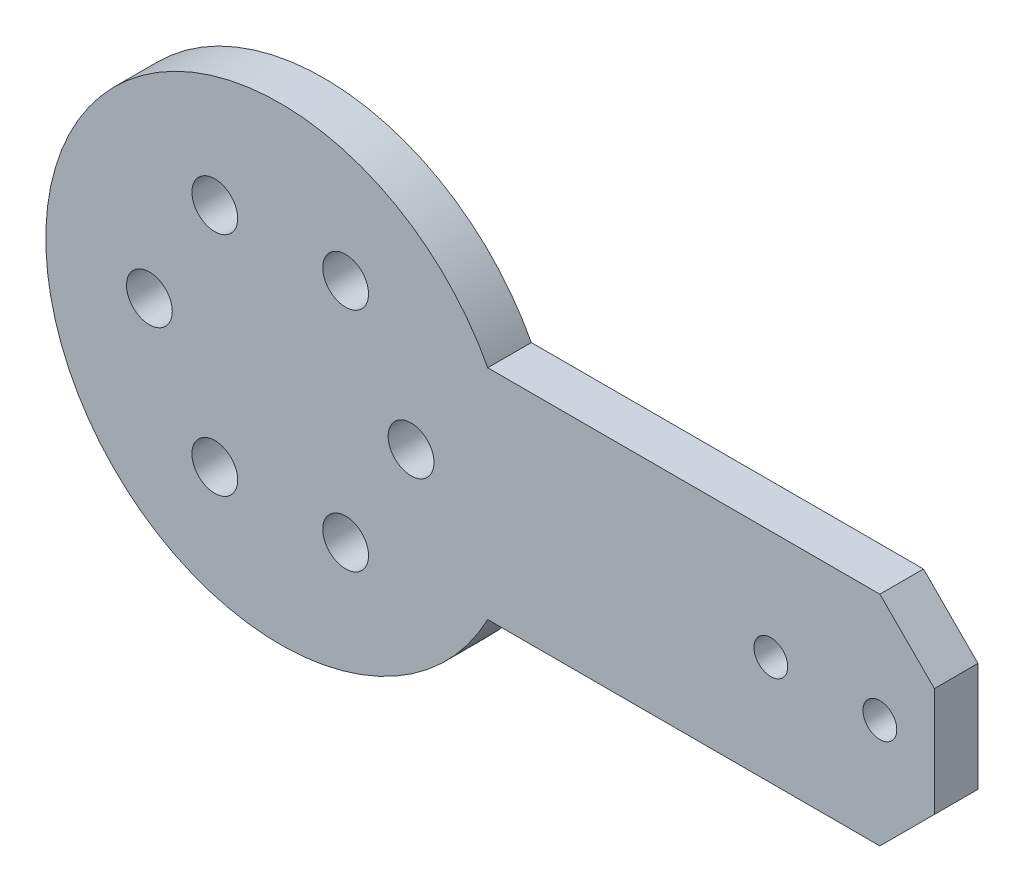
ISO-10303-21;
HEADER;
FILE_DESCRIPTION(('STEP AP214'),'2;1');
FILE_NAME('part.step','',(''),(''),'','','');
FILE_SCHEMA(('AUTOMOTIVE_DESIGN { 1 0 10303 214 1 1 1 1 }'));
ENDSEC;
DATA;
#1=APPLICATION_CONTEXT('core data for automotive mechanical design processes');
#2=APPLICATION_PROTOCOL_DEFINITION('international standard','automotive_design',2000,#1);
#3=PRODUCT_CONTEXT('',#1,'mechanical');
#4=PRODUCT('Part','Part','',(#3));
#5=PRODUCT_RELATED_PRODUCT_CATEGORY('part','',(#4));
#6=PRODUCT_DEFINITION_FORMATION('','',#4);
#7=PRODUCT_DEFINITION_CONTEXT('part definition',#1,'design');
#8=PRODUCT_DEFINITION('design','',#6,#7);
#9=PRODUCT_DEFINITION_SHAPE('','',#8);
#10=(LENGTH_UNIT() NAMED_UNIT(*) SI_UNIT(.MILLI.,.METRE.));
#11=(NAMED_UNIT(*) PLANE_ANGLE_UNIT() SI_UNIT($,.RADIAN.));
#12=(NAMED_UNIT(*) SI_UNIT($,.STERADIAN.) SOLID_ANGLE_UNIT());
#13=UNCERTAINTY_MEASURE_WITH_UNIT(LENGTH_MEASURE(1.E-05),#10,'distance_accuracy_value','');
#14=(GEOMETRIC_REPRESENTATION_CONTEXT(3) GLOBAL_UNCERTAINTY_ASSIGNED_CONTEXT((#13)) GLOBAL_UNIT_ASSIGNED_CONTEXT((#10,
#11,#12)) REPRESENTATION_CONTEXT('',''));
#15=CARTESIAN_POINT('',(0.,0.,0.));
#16=DIRECTION('',(0.,0.,1.));
#17=DIRECTION('',(1.,0.,0.));
#18=AXIS2_PLACEMENT_3D('',#15,#16,#17);
#19=CARTESIAN_POINT('',(0.,0.,-4.));
#20=DIRECTION('',(0.,0.,-1.));
#21=DIRECTION('',(1.,0.,0.));
#22=AXIS2_PLACEMENT_3D('',#19,#20,#21);
#23=PLANE('',#22);
#24=CARTESIAN_POINT('',(55.,0.,-4.));
#25=DIRECTION('',(0.,0.,1.));
#26=DIRECTION('',(1.,0.,0.));
#27=AXIS2_PLACEMENT_3D('',#24,#25,#26);
#28=CIRCLE('',#27,1.55);
#29=CARTESIAN_POINT('',(56.55,0.,-4.));
#30=VERTEX_POINT('',#29);
#31=EDGE_CURVE('E212',#30,#30,#28,.T.);
#32=ORIENTED_EDGE('',*,*,#31,.T.);
#33=EDGE_LOOP('',(#32));
#34=FACE_BOUND('',#33,.T.);
#35=CARTESIAN_POINT('',(45.,0.,-4.));
#36=DIRECTION('',(0.,0.,1.));
#37=DIRECTION('',(1.,0.,0.));
#38=AXIS2_PLACEMENT_3D('',#35,#36,#37);
#39=CIRCLE('',#38,1.55);
#40=CARTESIAN_POINT('',(46.55,0.,-4.));
#41=VERTEX_POINT('',#40);
#42=EDGE_CURVE('E213',#41,#41,#39,.T.);
#43=ORIENTED_EDGE('',*,*,#42,.T.);
#44=EDGE_LOOP('',(#43));
#45=FACE_BOUND('',#44,.T.);
#46=CARTESIAN_POINT('',(-5.9999999999999,10.3923048454133,-4.));
#47=DIRECTION('',(0.,0.,1.));
#48=DIRECTION('',(1.,0.,0.));
#49=AXIS2_PLACEMENT_3D('',#46,#47,#48);
#50=CIRCLE('',#49,2.1);
#51=CARTESIAN_POINT('',(-3.8999999999999,10.3923048454133,-4.));
#52=VERTEX_POINT('',#51);
#53=EDGE_CURVE('E229',#52,#52,#50,.T.);
#54=ORIENTED_EDGE('',*,*,#53,.T.);
#55=EDGE_LOOP('',(#54));
#56=FACE_BOUND('',#55,.T.);
#57=CARTESIAN_POINT('',(-6.00000000000005,-10.3923048454132,-4.));
#58=DIRECTION('',(0.,0.,1.));
#59=DIRECTION('',(1.,0.,0.));
#60=AXIS2_PLACEMENT_3D('',#57,#58,#59);
#61=CIRCLE('',#60,2.1);
#62=CARTESIAN_POINT('',(-3.90000000000005,-10.3923048454132,-4.));
#63=VERTEX_POINT('',#62);
#64=EDGE_CURVE('E241',#63,#63,#61,.T.);
#65=ORIENTED_EDGE('',*,*,#64,.T.);
#66=EDGE_LOOP('',(#65));
#67=FACE_BOUND('',#66,.T.);
#68=CARTESIAN_POINT('',(12.,0.,-4.));
#69=DIRECTION('',(0.,0.,1.));
#70=DIRECTION('',(1.,0.,0.));
#71=AXIS2_PLACEMENT_3D('',#68,#69,#70);
#72=CIRCLE('',#71,2.1);
#73=CARTESIAN_POINT('',(14.1,0.,-4.));
#74=VERTEX_POINT('',#73);
#75=EDGE_CURVE('E128',#74,#74,#72,.T.);
#76=ORIENTED_EDGE('',*,*,#75,.T.);
#77=EDGE_LOOP('',(#76));
#78=FACE_BOUND('',#77,.T.);
#79=DIRECTION('',(1.,0.,0.));
#80=VECTOR('',#79,1.);
#81=CARTESIAN_POINT('',(60.,-10.,-4.));
#82=LINE('',#81,#80);
#83=CARTESIAN_POINT('',(19.0328663106743,-10.,-4.));
#84=VERTEX_POINT('',#83);
#85=CARTESIAN_POINT('',(55.,-10.,-4.));
#86=VERTEX_POINT('',#85);
#87=EDGE_CURVE('E100',#84,#86,#82,.T.);
#88=ORIENTED_EDGE('',*,*,#87,.F.);
#89=CARTESIAN_POINT('',(0.,0.,-4.));
#90=DIRECTION('',(0.,0.,1.));
#91=DIRECTION('',(1.,0.,0.));
#92=AXIS2_PLACEMENT_3D('',#89,#90,#91);
#93=CIRCLE('',#92,21.5);
#94=CARTESIAN_POINT('',(19.0328663106743,10.,-4.));
#95=VERTEX_POINT('',#94);
#96=EDGE_CURVE('E110',#95,#84,#93,.T.);
#97=ORIENTED_EDGE('',*,*,#96,.F.);
#98=DIRECTION('',(-1.,0.,0.));
#99=VECTOR('',#98,1.);
#100=CARTESIAN_POINT('',(19.0328663106743,10.,-4.));
#101=LINE('',#100,#99);
#102=CARTESIAN_POINT('',(55.,10.,-4.));
#103=VERTEX_POINT('',#102);
#104=EDGE_CURVE('E121',#103,#95,#101,.T.);
#105=ORIENTED_EDGE('',*,*,#104,.F.);
#106=DIRECTION('',(0.707106781186545,-0.70710678118655,0.));
#107=VECTOR('',#106,1.);
#108=CARTESIAN_POINT('',(32.5000000000002,32.5,-4.));
#109=LINE('',#108,#107);
#110=CARTESIAN_POINT('',(60.,4.99999999999997,-4.));
#111=VERTEX_POINT('',#110);
#112=EDGE_CURVE('E145',#111,#103,#109,.F.);
#113=ORIENTED_EDGE('',*,*,#112,.F.);
#114=DIRECTION('',(0.,1.,0.));
#115=VECTOR('',#114,1.);
#116=CARTESIAN_POINT('',(60.,-10.,-4.));
#117=LINE('',#116,#115);
#118=CARTESIAN_POINT('',(60.,-5.00000000000001,-4.));
#119=VERTEX_POINT('',#118);
#120=EDGE_CURVE('E118',#119,#111,#117,.T.);
#121=ORIENTED_EDGE('',*,*,#120,.F.);
#122=DIRECTION('',(-0.707106781186549,-0.707106781186547,0.));
#123=VECTOR('',#122,1.);
#124=CARTESIAN_POINT('',(32.4999999999999,-32.5,-4.));
#125=LINE('',#124,#123);
#126=EDGE_CURVE('E51',#86,#119,#125,.F.);
#127=ORIENTED_EDGE('',*,*,#126,.F.);
#128=EDGE_LOOP('',(#88,#97,#105,#113,#121,#127));
#129=FACE_BOUND('',#128,.T.);
#130=CARTESIAN_POINT('',(5.99999999999998,-10.3923048454133,-4.));
#131=DIRECTION('',(0.,0.,1.));
#132=DIRECTION('',(1.,0.,0.));
#133=AXIS2_PLACEMENT_3D('',#130,#131,#132);
#134=CIRCLE('',#133,2.1);
#135=CARTESIAN_POINT('',(8.09999999999998,-10.3923048454133,-4.));
#136=VERTEX_POINT('',#135);
#137=EDGE_CURVE('E247',#136,#136,#134,.T.);
#138=ORIENTED_EDGE('',*,*,#137,.T.);
#139=EDGE_LOOP('',(#138));
#140=FACE_BOUND('',#139,.T.);
#141=CARTESIAN_POINT('',(-12.,0.,-4.));
#142=DIRECTION('',(0.,0.,1.));
#143=DIRECTION('',(1.,0.,0.));
#144=AXIS2_PLACEMENT_3D('',#141,#142,#143);
#145=CIRCLE('',#144,2.1);
#146=CARTESIAN_POINT('',(-9.9,0.,-4.));
#147=VERTEX_POINT('',#146);
#148=EDGE_CURVE('E235',#147,#147,#145,.T.);
#149=ORIENTED_EDGE('',*,*,#148,.T.);
#150=EDGE_LOOP('',(#149));
#151=FACE_BOUND('',#150,.T.);
#152=CARTESIAN_POINT('',(6.00000000000012,10.3923048454132,-4.));
#153=DIRECTION('',(0.,0.,1.));
#154=DIRECTION('',(1.,0.,0.));
#155=AXIS2_PLACEMENT_3D('',#152,#153,#154);
#156=CIRCLE('',#155,2.1);
#157=CARTESIAN_POINT('',(8.10000000000012,10.3923048454132,-4.));
#158=VERTEX_POINT('',#157);
#159=EDGE_CURVE('E223',#158,#158,#156,.T.);
#160=ORIENTED_EDGE('',*,*,#159,.T.);
#161=EDGE_LOOP('',(#160));
#162=FACE_BOUND('',#161,.T.);
#163=ADVANCED_FACE('F43',(#34,#45,#56,#67,#78,#129,#140,#151,#162),#23,.T.);
#164=CARTESIAN_POINT('',(0.,0.,0.));
#165=DIRECTION('',(0.,0.,-1.));
#166=DIRECTION('',(1.,0.,0.));
#167=AXIS2_PLACEMENT_3D('',#164,#165,#166);
#168=PLANE('',#167);
#169=CARTESIAN_POINT('',(55.,0.,0.));
#170=DIRECTION('',(0.,0.,1.));
#171=DIRECTION('',(1.,0.,0.));
#172=AXIS2_PLACEMENT_3D('',#169,#170,#171);
#173=CIRCLE('',#172,1.55);
#174=CARTESIAN_POINT('',(56.55,0.,0.));
#175=VERTEX_POINT('',#174);
#176=EDGE_CURVE('E210',#175,#175,#173,.T.);
#177=ORIENTED_EDGE('',*,*,#176,.F.);
#178=EDGE_LOOP('',(#177));
#179=FACE_BOUND('',#178,.T.);
#180=CARTESIAN_POINT('',(45.,0.,0.));
#181=DIRECTION('',(0.,0.,1.));
#182=DIRECTION('',(1.,0.,0.));
#183=AXIS2_PLACEMENT_3D('',#180,#181,#182);
#184=CIRCLE('',#183,1.55);
#185=CARTESIAN_POINT('',(46.55,0.,0.));
#186=VERTEX_POINT('',#185);
#187=EDGE_CURVE('E218',#186,#186,#184,.T.);
#188=ORIENTED_EDGE('',*,*,#187,.F.);
#189=EDGE_LOOP('',(#188));
#190=FACE_BOUND('',#189,.T.);
#191=DIRECTION('',(0.,1.,0.));
#192=VECTOR('',#191,1.);
#193=CARTESIAN_POINT('',(60.,-10.,0.));
#194=LINE('',#193,#192);
#195=CARTESIAN_POINT('',(60.,-5.00000000000001,0.));
#196=VERTEX_POINT('',#195);
#197=CARTESIAN_POINT('',(60.,4.99999999999997,0.));
#198=VERTEX_POINT('',#197);
#199=EDGE_CURVE('E130',#196,#198,#194,.T.);
#200=ORIENTED_EDGE('',*,*,#199,.T.);
#201=DIRECTION('',(-0.707106781186545,0.70710678118655,0.));
#202=VECTOR('',#201,1.);
#203=CARTESIAN_POINT('',(55.,10.,0.));
#204=LINE('',#203,#202);
#205=CARTESIAN_POINT('',(55.,10.,0.));
#206=VERTEX_POINT('',#205);
#207=EDGE_CURVE('E139',#206,#198,#204,.F.);
#208=ORIENTED_EDGE('',*,*,#207,.F.);
#209=DIRECTION('',(-1.,0.,0.));
#210=VECTOR('',#209,1.);
#211=CARTESIAN_POINT('',(19.0328663106743,10.,0.));
#212=LINE('',#211,#210);
#213=CARTESIAN_POINT('',(19.0328663106743,10.,0.));
#214=VERTEX_POINT('',#213);
#215=EDGE_CURVE('E114',#206,#214,#212,.T.);
#216=ORIENTED_EDGE('',*,*,#215,.T.);
#217=CARTESIAN_POINT('',(0.,0.,0.));
#218=DIRECTION('',(0.,0.,1.));
#219=DIRECTION('',(1.,0.,0.));
#220=AXIS2_PLACEMENT_3D('',#217,#218,#219);
#221=CIRCLE('',#220,21.5);
#222=CARTESIAN_POINT('',(19.0328663106743,-10.,0.));
#223=VERTEX_POINT('',#222);
#224=EDGE_CURVE('E126',#214,#223,#221,.T.);
#225=ORIENTED_EDGE('',*,*,#224,.T.);
#226=DIRECTION('',(1.,0.,0.));
#227=VECTOR('',#226,1.);
#228=CARTESIAN_POINT('',(60.,-10.,0.));
#229=LINE('',#228,#227);
#230=CARTESIAN_POINT('',(55.,-10.,0.));
#231=VERTEX_POINT('',#230);
#232=EDGE_CURVE('E102',#223,#231,#229,.T.);
#233=ORIENTED_EDGE('',*,*,#232,.T.);
#234=DIRECTION('',(0.707106781186549,0.707106781186547,0.));
#235=VECTOR('',#234,1.);
#236=CARTESIAN_POINT('',(60.,-5.00000000000001,0.));
#237=LINE('',#236,#235);
#238=EDGE_CURVE('E142',#196,#231,#237,.F.);
#239=ORIENTED_EDGE('',*,*,#238,.F.);
#240=EDGE_LOOP('',(#200,#208,#216,#225,#233,#239));
#241=FACE_BOUND('',#240,.T.);
#242=CARTESIAN_POINT('',(12.,0.,0.));
#243=DIRECTION('',(0.,0.,1.));
#244=DIRECTION('',(1.,0.,0.));
#245=AXIS2_PLACEMENT_3D('',#242,#243,#244);
#246=CIRCLE('',#245,2.1);
#247=CARTESIAN_POINT('',(14.1,0.,0.));
#248=VERTEX_POINT('',#247);
#249=EDGE_CURVE('E250',#248,#248,#246,.T.);
#250=ORIENTED_EDGE('',*,*,#249,.F.);
#251=EDGE_LOOP('',(#250));
#252=FACE_BOUND('',#251,.T.);
#253=CARTESIAN_POINT('',(5.99999999999998,-10.3923048454133,0.));
#254=DIRECTION('',(0.,0.,1.));
#255=DIRECTION('',(1.,0.,0.));
#256=AXIS2_PLACEMENT_3D('',#253,#254,#255);
#257=CIRCLE('',#256,2.1);
#258=CARTESIAN_POINT('',(8.09999999999998,-10.3923048454133,0.));
#259=VERTEX_POINT('',#258);
#260=EDGE_CURVE('E244',#259,#259,#257,.T.);
#261=ORIENTED_EDGE('',*,*,#260,.F.);
#262=EDGE_LOOP('',(#261));
#263=FACE_BOUND('',#262,.T.);
#264=CARTESIAN_POINT('',(-6.00000000000005,-10.3923048454132,0.));
#265=DIRECTION('',(0.,0.,1.));
#266=DIRECTION('',(1.,0.,0.));
#267=AXIS2_PLACEMENT_3D('',#264,#265,#266);
#268=CIRCLE('',#267,2.1);
#269=CARTESIAN_POINT('',(-3.90000000000005,-10.3923048454132,0.));
#270=VERTEX_POINT('',#269);
#271=EDGE_CURVE('E238',#270,#270,#268,.T.);
#272=ORIENTED_EDGE('',*,*,#271,.F.);
#273=EDGE_LOOP('',(#272));
#274=FACE_BOUND('',#273,.T.);
#275=CARTESIAN_POINT('',(-12.,0.,0.));
#276=DIRECTION('',(0.,0.,1.));
#277=DIRECTION('',(1.,0.,0.));
#278=AXIS2_PLACEMENT_3D('',#275,#276,#277);
#279=CIRCLE('',#278,2.1);
#280=CARTESIAN_POINT('',(-9.9,0.,0.));
#281=VERTEX_POINT('',#280);
#282=EDGE_CURVE('E232',#281,#281,#279,.T.);
#283=ORIENTED_EDGE('',*,*,#282,.F.);
#284=EDGE_LOOP('',(#283));
#285=FACE_BOUND('',#284,.T.);
#286=CARTESIAN_POINT('',(-5.9999999999999,10.3923048454133,0.));
#287=DIRECTION('',(0.,0.,1.));
#288=DIRECTION('',(1.,0.,0.));
#289=AXIS2_PLACEMENT_3D('',#286,#287,#288);
#290=CIRCLE('',#289,2.1);
#291=CARTESIAN_POINT('',(-3.8999999999999,10.3923048454133,0.));
#292=VERTEX_POINT('',#291);
#293=EDGE_CURVE('E226',#292,#292,#290,.T.);
#294=ORIENTED_EDGE('',*,*,#293,.F.);
#295=EDGE_LOOP('',(#294));
#296=FACE_BOUND('',#295,.T.);
#297=CARTESIAN_POINT('',(6.00000000000012,10.3923048454132,0.));
#298=DIRECTION('',(0.,0.,1.));
#299=DIRECTION('',(1.,0.,0.));
#300=AXIS2_PLACEMENT_3D('',#297,#298,#299);
#301=CIRCLE('',#300,2.1);
#302=CARTESIAN_POINT('',(8.10000000000012,10.3923048454132,0.));
#303=VERTEX_POINT('',#302);
#304=EDGE_CURVE('E215',#303,#303,#301,.T.);
#305=ORIENTED_EDGE('',*,*,#304,.F.);
#306=EDGE_LOOP('',(#305));
#307=FACE_BOUND('',#306,.T.);
#308=ADVANCED_FACE('F154',(#179,#190,#241,#252,#263,#274,#285,#296,#307),#168,.F.);
#309=CARTESIAN_POINT('',(0.,0.,-4.));
#310=DIRECTION('',(0.,0.,1.));
#311=DIRECTION('',(-1.,0.,0.));
#312=AXIS2_PLACEMENT_3D('',#309,#310,#311);
#313=CYLINDRICAL_SURFACE('',#312,21.5);
#314=ORIENTED_EDGE('',*,*,#224,.F.);
#315=DIRECTION('',(0.,0.,1.));
#316=VECTOR('',#315,1.);
#317=CARTESIAN_POINT('',(19.0328663106743,10.,-4.));
#318=LINE('',#317,#316);
#319=EDGE_CURVE('E107',#95,#214,#318,.T.);
#320=ORIENTED_EDGE('',*,*,#319,.F.);
#321=ORIENTED_EDGE('',*,*,#96,.T.);
#322=DIRECTION('',(0.,0.,1.));
#323=VECTOR('',#322,1.);
#324=CARTESIAN_POINT('',(19.0328663106743,-10.,-4.));
#325=LINE('',#324,#323);
#326=EDGE_CURVE('E96',#84,#223,#325,.T.);
#327=ORIENTED_EDGE('',*,*,#326,.T.);
#328=EDGE_LOOP('',(#314,#320,#321,#327));
#329=FACE_BOUND('',#328,.T.);
#330=ADVANCED_FACE('F111',(#329),#313,.T.);
#331=CARTESIAN_POINT('',(60.,-10.,-4.));
#332=DIRECTION('',(0.,1.,0.));
#333=DIRECTION('',(-1.,0.,0.));
#334=AXIS2_PLACEMENT_3D('',#331,#332,#333);
#335=PLANE('',#334);
#336=ORIENTED_EDGE('',*,*,#232,.F.);
#337=ORIENTED_EDGE('',*,*,#326,.F.);
#338=ORIENTED_EDGE('',*,*,#87,.T.);
#339=DIRECTION('',(0.,0.,-1.));
#340=VECTOR('',#339,1.);
#341=CARTESIAN_POINT('',(55.,-10.,-4.));
#342=LINE('',#341,#340);
#343=EDGE_CURVE('E64',#231,#86,#342,.T.);
#344=ORIENTED_EDGE('',*,*,#343,.F.);
#345=EDGE_LOOP('',(#336,#337,#338,#344));
#346=FACE_BOUND('',#345,.T.);
#347=ADVANCED_FACE('F98',(#346),#335,.F.);
#348=CARTESIAN_POINT('',(60.,-10.,-4.));
#349=DIRECTION('',(-1.,0.,0.));
#350=DIRECTION('',(0.,0.,-1.));
#351=AXIS2_PLACEMENT_3D('',#348,#349,#350);
#352=PLANE('',#351);
#353=ORIENTED_EDGE('',*,*,#120,.T.);
#354=DIRECTION('',(0.,0.,-1.));
#355=VECTOR('',#354,1.);
#356=CARTESIAN_POINT('',(60.,4.99999999999997,-4.));
#357=LINE('',#356,#355);
#358=EDGE_CURVE('E106',#198,#111,#357,.T.);
#359=ORIENTED_EDGE('',*,*,#358,.F.);
#360=ORIENTED_EDGE('',*,*,#199,.F.);
#361=DIRECTION('',(0.,0.,1.));
#362=VECTOR('',#361,1.);
#363=CARTESIAN_POINT('',(60.,-5.00000000000001,-4.));
#364=LINE('',#363,#362);
#365=EDGE_CURVE('E137',#119,#196,#364,.T.);
#366=ORIENTED_EDGE('',*,*,#365,.F.);
#367=EDGE_LOOP('',(#353,#359,#360,#366));
#368=FACE_BOUND('',#367,.T.);
#369=ADVANCED_FACE('F150',(#368),#352,.F.);
#370=CARTESIAN_POINT('',(19.0328663106743,10.,-4.));
#371=DIRECTION('',(0.,-1.,0.));
#372=DIRECTION('',(0.,0.,1.));
#373=AXIS2_PLACEMENT_3D('',#370,#371,#372);
#374=PLANE('',#373);
#375=ORIENTED_EDGE('',*,*,#104,.T.);
#376=ORIENTED_EDGE('',*,*,#319,.T.);
#377=ORIENTED_EDGE('',*,*,#215,.F.);
#378=DIRECTION('',(0.,0.,1.));
#379=VECTOR('',#378,1.);
#380=CARTESIAN_POINT('',(55.,10.,-4.));
#381=LINE('',#380,#379);
#382=EDGE_CURVE('E11',#103,#206,#381,.T.);
#383=ORIENTED_EDGE('',*,*,#382,.F.);
#384=EDGE_LOOP('',(#375,#376,#377,#383));
#385=FACE_BOUND('',#384,.T.);
#386=ADVANCED_FACE('F156',(#385),#374,.F.);
#387=CARTESIAN_POINT('',(12.,0.,-4.));
#388=DIRECTION('',(0.,0.,1.));
#389=DIRECTION('',(-1.,0.,0.));
#390=AXIS2_PLACEMENT_3D('',#387,#388,#389);
#391=CYLINDRICAL_SURFACE('',#390,2.1);
#392=ORIENTED_EDGE('',*,*,#75,.F.);
#393=EDGE_LOOP('',(#392));
#394=FACE_BOUND('',#393,.T.);
#395=ORIENTED_EDGE('',*,*,#249,.T.);
#396=EDGE_LOOP('',(#395));
#397=FACE_BOUND('',#396,.T.);
#398=ADVANCED_FACE('F158',(#394,#397),#391,.F.);
#399=CARTESIAN_POINT('',(5.99999999999998,-10.3923048454133,-4.));
#400=DIRECTION('',(0.,0.,1.));
#401=DIRECTION('',(-1.,0.,0.));
#402=AXIS2_PLACEMENT_3D('',#399,#400,#401);
#403=CYLINDRICAL_SURFACE('',#402,2.1);
#404=ORIENTED_EDGE('',*,*,#137,.F.);
#405=EDGE_LOOP('',(#404));
#406=FACE_BOUND('',#405,.T.);
#407=ORIENTED_EDGE('',*,*,#260,.T.);
#408=EDGE_LOOP('',(#407));
#409=FACE_BOUND('',#408,.T.);
#410=ADVANCED_FACE('F164',(#406,#409),#403,.F.);
#411=CARTESIAN_POINT('',(-6.00000000000005,-10.3923048454132,-4.));
#412=DIRECTION('',(0.,0.,1.));
#413=DIRECTION('',(-1.,0.,0.));
#414=AXIS2_PLACEMENT_3D('',#411,#412,#413);
#415=CYLINDRICAL_SURFACE('',#414,2.1);
#416=ORIENTED_EDGE('',*,*,#64,.F.);
#417=EDGE_LOOP('',(#416));
#418=FACE_BOUND('',#417,.T.);
#419=ORIENTED_EDGE('',*,*,#271,.T.);
#420=EDGE_LOOP('',(#419));
#421=FACE_BOUND('',#420,.T.);
#422=ADVANCED_FACE('F181',(#418,#421),#415,.F.);
#423=CARTESIAN_POINT('',(-12.,0.,-4.));
#424=DIRECTION('',(0.,0.,1.));
#425=DIRECTION('',(-1.,0.,0.));
#426=AXIS2_PLACEMENT_3D('',#423,#424,#425);
#427=CYLINDRICAL_SURFACE('',#426,2.1);
#428=ORIENTED_EDGE('',*,*,#148,.F.);
#429=EDGE_LOOP('',(#428));
#430=FACE_BOUND('',#429,.T.);
#431=ORIENTED_EDGE('',*,*,#282,.T.);
#432=EDGE_LOOP('',(#431));
#433=FACE_BOUND('',#432,.T.);
#434=ADVANCED_FACE('F185',(#430,#433),#427,.F.);
#435=CARTESIAN_POINT('',(-5.9999999999999,10.3923048454133,-4.));
#436=DIRECTION('',(0.,0.,1.));
#437=DIRECTION('',(-1.,0.,0.));
#438=AXIS2_PLACEMENT_3D('',#435,#436,#437);
#439=CYLINDRICAL_SURFACE('',#438,2.1);
#440=ORIENTED_EDGE('',*,*,#53,.F.);
#441=EDGE_LOOP('',(#440));
#442=FACE_BOUND('',#441,.T.);
#443=ORIENTED_EDGE('',*,*,#293,.T.);
#444=EDGE_LOOP('',(#443));
#445=FACE_BOUND('',#444,.T.);
#446=ADVANCED_FACE('F189',(#442,#445),#439,.F.);
#447=CARTESIAN_POINT('',(6.00000000000012,10.3923048454132,-4.));
#448=DIRECTION('',(0.,0.,1.));
#449=DIRECTION('',(-1.,0.,0.));
#450=AXIS2_PLACEMENT_3D('',#447,#448,#449);
#451=CYLINDRICAL_SURFACE('',#450,2.1);
#452=ORIENTED_EDGE('',*,*,#159,.F.);
#453=EDGE_LOOP('',(#452));
#454=FACE_BOUND('',#453,.T.);
#455=ORIENTED_EDGE('',*,*,#304,.T.);
#456=EDGE_LOOP('',(#455));
#457=FACE_BOUND('',#456,.T.);
#458=ADVANCED_FACE('F193',(#454,#457),#451,.F.);
#459=CARTESIAN_POINT('',(60.,-5.00000000000001,-4.));
#460=DIRECTION('',(-0.707106781186547,0.707106781186549,0.));
#461=DIRECTION('',(0.,0.,1.));
#462=AXIS2_PLACEMENT_3D('',#459,#460,#461);
#463=PLANE('',#462);
#464=ORIENTED_EDGE('',*,*,#126,.T.);
#465=ORIENTED_EDGE('',*,*,#365,.T.);
#466=ORIENTED_EDGE('',*,*,#238,.T.);
#467=ORIENTED_EDGE('',*,*,#343,.T.);
#468=EDGE_LOOP('',(#464,#465,#466,#467));
#469=FACE_BOUND('',#468,.T.);
#470=ADVANCED_FACE('F146',(#469),#463,.F.);
#471=CARTESIAN_POINT('',(55.,10.,-4.));
#472=DIRECTION('',(-0.707106781186551,-0.707106781186545,0.));
#473=DIRECTION('',(0.,0.,1.));
#474=AXIS2_PLACEMENT_3D('',#471,#472,#473);
#475=PLANE('',#474);
#476=ORIENTED_EDGE('',*,*,#112,.T.);
#477=ORIENTED_EDGE('',*,*,#382,.T.);
#478=ORIENTED_EDGE('',*,*,#207,.T.);
#479=ORIENTED_EDGE('',*,*,#358,.T.);
#480=EDGE_LOOP('',(#476,#477,#478,#479));
#481=FACE_BOUND('',#480,.T.);
#482=ADVANCED_FACE('F45',(#481),#475,.F.);
#483=CARTESIAN_POINT('',(45.,0.,0.));
#484=DIRECTION('',(0.,0.,-1.));
#485=DIRECTION('',(1.,0.,0.));
#486=AXIS2_PLACEMENT_3D('',#483,#484,#485);
#487=CYLINDRICAL_SURFACE('',#486,1.55);
#488=ORIENTED_EDGE('',*,*,#187,.T.);
#489=EDGE_LOOP('',(#488));
#490=FACE_BOUND('',#489,.T.);
#491=ORIENTED_EDGE('',*,*,#42,.F.);
#492=EDGE_LOOP('',(#491));
#493=FACE_BOUND('',#492,.T.);
#494=ADVANCED_FACE('F198',(#490,#493),#487,.F.);
#495=CARTESIAN_POINT('',(55.,0.,0.));
#496=DIRECTION('',(0.,0.,-1.));
#497=DIRECTION('',(1.,0.,0.));
#498=AXIS2_PLACEMENT_3D('',#495,#496,#497);
#499=CYLINDRICAL_SURFACE('',#498,1.55);
#500=ORIENTED_EDGE('',*,*,#176,.T.);
#501=EDGE_LOOP('',(#500));
#502=FACE_BOUND('',#501,.T.);
#503=ORIENTED_EDGE('',*,*,#31,.F.);
#504=EDGE_LOOP('',(#503));
#505=FACE_BOUND('',#504,.T.);
#506=ADVANCED_FACE('F201',(#502,#505),#499,.F.);
#507=CLOSED_SHELL('',(#163,#308,#330,#347,#369,#386,#398,#410,#422,#434,#446,#458,#470,#482,
#494,#506));
#508=MANIFOLD_SOLID_BREP('B2',#507);
#509=ADVANCED_BREP_SHAPE_REPRESENTATION('',(#18,#508),#14);
#510=SHAPE_DEFINITION_REPRESENTATION(#9,#509);
ENDSEC;
END-ISO-10303-21;
